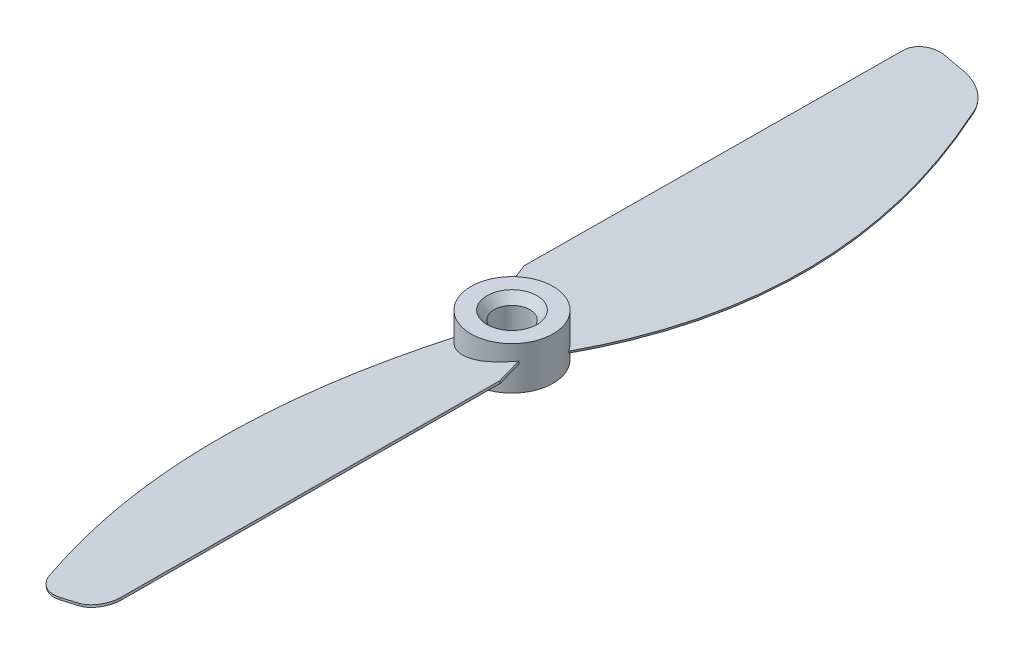
ISO-10303-21;
HEADER;
FILE_DESCRIPTION(('STEP AP214'),'2;1');
FILE_NAME('part.step','',(''),(''),'','','');
FILE_SCHEMA(('AUTOMOTIVE_DESIGN { 1 0 10303 214 1 1 1 1 }'));
ENDSEC;
DATA;
#1=APPLICATION_CONTEXT('core data for automotive mechanical design processes');
#2=APPLICATION_PROTOCOL_DEFINITION('international standard','automotive_design',2000,#1);
#3=PRODUCT_CONTEXT('',#1,'mechanical');
#4=PRODUCT('Part','Part','',(#3));
#5=PRODUCT_RELATED_PRODUCT_CATEGORY('part','',(#4));
#6=PRODUCT_DEFINITION_FORMATION('','',#4);
#7=PRODUCT_DEFINITION_CONTEXT('part definition',#1,'design');
#8=PRODUCT_DEFINITION('design','',#6,#7);
#9=PRODUCT_DEFINITION_SHAPE('','',#8);
#10=(LENGTH_UNIT() NAMED_UNIT(*) SI_UNIT(.MILLI.,.METRE.));
#11=(NAMED_UNIT(*) PLANE_ANGLE_UNIT() SI_UNIT($,.RADIAN.));
#12=(NAMED_UNIT(*) SI_UNIT($,.STERADIAN.) SOLID_ANGLE_UNIT());
#13=UNCERTAINTY_MEASURE_WITH_UNIT(LENGTH_MEASURE(1.E-05),#10,'distance_accuracy_value','');
#14=(GEOMETRIC_REPRESENTATION_CONTEXT(3) GLOBAL_UNCERTAINTY_ASSIGNED_CONTEXT((#13)) GLOBAL_UNIT_ASSIGNED_CONTEXT((#10,
#11,#12)) REPRESENTATION_CONTEXT('',''));
#15=CARTESIAN_POINT('',(0.,0.,0.));
#16=DIRECTION('',(0.,0.,1.));
#17=DIRECTION('',(1.,0.,0.));
#18=AXIS2_PLACEMENT_3D('',#15,#16,#17);
#19=CARTESIAN_POINT('',(0.,3.,0.));
#20=DIRECTION('',(0.,-1.,0.));
#21=DIRECTION('',(0.,0.,-1.));
#22=AXIS2_PLACEMENT_3D('',#19,#20,#21);
#23=CYLINDRICAL_SURFACE('',#22,5.75);
#24=CARTESIAN_POINT('',(0.,-0.307891232338017,0.));
#25=DIRECTION('',(0.224951054343865,0.974370064785235,0.));
#26=DIRECTION('',(0.974370064785235,-0.224951054343865,0.));
#27=AXIS2_PLACEMENT_3D('',#24,#25,#26);
#28=ELLIPSE('',#27,5.901248619812,5.75);
#29=CARTESIAN_POINT('',(4.78791337667616,-1.41326813287713,-3.18408314863879));
#30=VERTEX_POINT('',#29);
#31=CARTESIAN_POINT('',(-2.37394242916437,0.240176562119387,-5.23706953772939));
#32=VERTEX_POINT('',#31);
#33=EDGE_CURVE('E287',#30,#32,#28,.T.);
#34=ORIENTED_EDGE('',*,*,#33,.F.);
#35=CARTESIAN_POINT('',(4.82986929270787,-1.11506318698037,-3.12007413619574));
#36=CARTESIAN_POINT('',(4.82292127069583,-1.16475166658804,-3.13082907042638));
#37=CARTESIAN_POINT('',(4.81595093335384,-1.21444631854994,-3.14154062191195));
#38=CARTESIAN_POINT('',(4.80196562800994,-1.31384796718219,-3.16287695939297));
#39=CARTESIAN_POINT('',(4.79495066000803,-1.36355496385255,-3.17350174538841));
#40=CARTESIAN_POINT('',(4.78791337667616,-1.41326813287713,-3.18408314863879));
#41=B_SPLINE_CURVE_WITH_KNOTS('',3,(#35,#36,#37,#38,#39,#40),.UNSPECIFIED.,.F.,.F.,(4,2,4),(0.,
0.153934831482453,0.307869662964906),.UNSPECIFIED.);
#42=CARTESIAN_POINT('',(4.82986929270787,-1.11506318698037,-3.12007413619574));
#43=VERTEX_POINT('',#42);
#44=EDGE_CURVE('E278',#43,#30,#41,.T.);
#45=ORIENTED_EDGE('',*,*,#44,.F.);
#46=CARTESIAN_POINT('',(0.,0.,0.));
#47=DIRECTION('',(0.224951054343865,0.974370064785235,0.));
#48=DIRECTION('',(0.974370064785235,-0.224951054343865,0.));
#49=AXIS2_PLACEMENT_3D('',#46,#47,#48);
#50=ELLIPSE('',#49,5.901248619812,5.75);
#51=CARTESIAN_POINT('',(-2.6811952004603,0.619002685984812,-5.08661894553039));
#52=VERTEX_POINT('',#51);
#53=EDGE_CURVE('E389',#43,#52,#50,.T.);
#54=ORIENTED_EDGE('',*,*,#53,.T.);
#55=CARTESIAN_POINT('',(-2.37394242916438,0.240176562119388,-5.23706953772939));
#56=CARTESIAN_POINT('',(-2.39044343595495,0.262017553280154,-5.22958997272626));
#57=CARTESIAN_POINT('',(-2.40708173850052,0.283700087275911,-5.22195362383161));
#58=CARTESIAN_POINT('',(-2.44058343183624,0.326765324251707,-5.20638001088834));
#59=CARTESIAN_POINT('',(-2.45744672283187,0.348148152067933,-5.19844287755547));
#60=CARTESIAN_POINT('',(-2.49136029475435,0.39064621501174,-5.18227526246907));
#61=CARTESIAN_POINT('',(-2.50841054379051,0.411761494491954,-5.17404483022275));
#62=CARTESIAN_POINT('',(-2.54265942368253,0.453755729119978,-5.15730029922399));
#63=CARTESIAN_POINT('',(-2.55985804673507,0.474634696564034,-5.14878621532282));
#64=CARTESIAN_POINT('',(-2.59436950322992,0.516191560804143,-5.13148315678602));
#65=CARTESIAN_POINT('',(-2.61168236099832,0.536869412290609,-5.12269412200461));
#66=CARTESIAN_POINT('',(-2.64638880225902,0.578056786100979,-5.10485141163782));
#67=CARTESIAN_POINT('',(-2.66378241288782,0.598566244288931,-5.09579764071252));
#68=CARTESIAN_POINT('',(-2.68119520046029,0.619002685984805,-5.08661894553039));
#69=B_SPLINE_CURVE_WITH_KNOTS('',3,(#55,#56,#57,#58,#59,#60,#61,#62,#63,#64,#65,#66,#67,#68),
.UNSPECIFIED.,.F.,.F.,(4,2,2,2,2,2,4),(0.,0.0851287380510146,0.170220895584758,
0.255298757449764,0.340372171835597,0.425464328065218,0.510587515560284),.UNSPECIFIED.);
#70=EDGE_CURVE('E288',#32,#52,#69,.T.);
#71=ORIENTED_EDGE('',*,*,#70,.F.);
#72=EDGE_LOOP('',(#34,#45,#54,#71));
#73=FACE_BOUND('',#72,.T.);
#74=CARTESIAN_POINT('',(0.,3.,0.));
#75=DIRECTION('',(0.,1.,0.));
#76=DIRECTION('',(0.,0.,1.));
#77=AXIS2_PLACEMENT_3D('',#74,#75,#76);
#78=CIRCLE('',#77,5.75);
#79=CARTESIAN_POINT('',(0.,3.,5.75));
#80=VERTEX_POINT('',#79);
#81=EDGE_CURVE('E383',#80,#80,#78,.T.);
#82=ORIENTED_EDGE('',*,*,#81,.F.);
#83=EDGE_LOOP('',(#82));
#84=FACE_BOUND('',#83,.T.);
#85=CARTESIAN_POINT('',(0.,-3.,0.));
#86=DIRECTION('',(0.,1.,0.));
#87=DIRECTION('',(0.,0.,1.));
#88=AXIS2_PLACEMENT_3D('',#85,#86,#87);
#89=CIRCLE('',#88,5.75);
#90=CARTESIAN_POINT('',(0.,-3.,5.75));
#91=VERTEX_POINT('',#90);
#92=EDGE_CURVE('E380',#91,#91,#89,.T.);
#93=ORIENTED_EDGE('',*,*,#92,.T.);
#94=EDGE_LOOP('',(#93));
#95=FACE_BOUND('',#94,.T.);
#96=CARTESIAN_POINT('',(0.,-0.307891232338017,0.));
#97=DIRECTION('',(-0.224951054343865,0.974370064785235,0.));
#98=DIRECTION('',(-0.974370064785235,-0.224951054343865,0.));
#99=AXIS2_PLACEMENT_3D('',#96,#97,#98);
#100=ELLIPSE('',#99,5.901248619812,5.75);
#101=CARTESIAN_POINT('',(-4.78791337667616,-1.41326813287713,3.18408314863879));
#102=VERTEX_POINT('',#101);
#103=CARTESIAN_POINT('',(2.37394242916437,0.240176562119387,5.23706953772939));
#104=VERTEX_POINT('',#103);
#105=EDGE_CURVE('E163',#102,#104,#100,.T.);
#106=ORIENTED_EDGE('',*,*,#105,.F.);
#107=CARTESIAN_POINT('',(-4.82986929270787,-1.11506318698037,3.12007413619574));
#108=CARTESIAN_POINT('',(-4.82292127069583,-1.16475166658804,3.13082907042638));
#109=CARTESIAN_POINT('',(-4.81595093335384,-1.21444631854994,3.14154062191195));
#110=CARTESIAN_POINT('',(-4.80196562800994,-1.31384796718219,3.16287695939297));
#111=CARTESIAN_POINT('',(-4.79495066000803,-1.36355496385255,3.17350174538841));
#112=CARTESIAN_POINT('',(-4.78791337667616,-1.41326813287713,3.18408314863879));
#113=B_SPLINE_CURVE_WITH_KNOTS('',3,(#107,#108,#109,#110,#111,#112),.UNSPECIFIED.,.F.,.F.,(4,2,
4),(0.,0.153934831482453,0.307869662964906),.UNSPECIFIED.);
#114=CARTESIAN_POINT('',(-4.82986929270787,-1.11506318698037,3.12007413619574));
#115=VERTEX_POINT('',#114);
#116=EDGE_CURVE('E312',#115,#102,#113,.T.);
#117=ORIENTED_EDGE('',*,*,#116,.F.);
#118=CARTESIAN_POINT('',(0.,0.,0.));
#119=DIRECTION('',(-0.224951054343865,0.974370064785235,0.));
#120=DIRECTION('',(-0.974370064785235,-0.224951054343865,0.));
#121=AXIS2_PLACEMENT_3D('',#118,#119,#120);
#122=ELLIPSE('',#121,5.901248619812,5.75);
#123=CARTESIAN_POINT('',(2.6811952004603,0.619002685984812,5.08661894553039));
#124=VERTEX_POINT('',#123);
#125=EDGE_CURVE('E313',#115,#124,#122,.T.);
#126=ORIENTED_EDGE('',*,*,#125,.T.);
#127=CARTESIAN_POINT('',(2.37394242916438,0.240176562119388,5.23706953772939));
#128=CARTESIAN_POINT('',(2.39044343595495,0.262017553280154,5.22958997272626));
#129=CARTESIAN_POINT('',(2.40708173850052,0.283700087275911,5.22195362383161));
#130=CARTESIAN_POINT('',(2.44058343183624,0.326765324251707,5.20638001088834));
#131=CARTESIAN_POINT('',(2.45744672283187,0.348148152067933,5.19844287755547));
#132=CARTESIAN_POINT('',(2.49136029475435,0.39064621501174,5.18227526246907));
#133=CARTESIAN_POINT('',(2.50841054379051,0.411761494491954,5.17404483022275));
#134=CARTESIAN_POINT('',(2.54265942368253,0.453755729119978,5.15730029922399));
#135=CARTESIAN_POINT('',(2.55985804673507,0.474634696564034,5.14878621532282));
#136=CARTESIAN_POINT('',(2.59436950322992,0.516191560804143,5.13148315678602));
#137=CARTESIAN_POINT('',(2.61168236099832,0.536869412290609,5.12269412200461));
#138=CARTESIAN_POINT('',(2.64638880225902,0.578056786100979,5.10485141163782));
#139=CARTESIAN_POINT('',(2.66378241288782,0.598566244288931,5.09579764071252));
#140=CARTESIAN_POINT('',(2.68119520046029,0.619002685984805,5.08661894553039));
#141=B_SPLINE_CURVE_WITH_KNOTS('',3,(#127,#128,#129,#130,#131,#132,#133,#134,#135,#136,#137,
#138,#139,#140),.UNSPECIFIED.,.F.,.F.,(4,2,2,2,2,2,4),(0.,0.0851287380510146,0.170220895584758,
0.255298757449764,0.340372171835597,0.425464328065218,0.510587515560284),.UNSPECIFIED.);
#142=EDGE_CURVE('E305',#104,#124,#141,.T.);
#143=ORIENTED_EDGE('',*,*,#142,.F.);
#144=EDGE_LOOP('',(#106,#117,#126,#143));
#145=FACE_BOUND('',#144,.T.);
#146=ADVANCED_FACE('F41',(#73,#84,#95,#145),#23,.T.);
#147=CARTESIAN_POINT('',(0.,3.,0.));
#148=DIRECTION('',(0.,1.,0.));
#149=DIRECTION('',(0.,0.,1.));
#150=AXIS2_PLACEMENT_3D('',#147,#148,#149);
#151=PLANE('',#150);
#152=CARTESIAN_POINT('',(0.,3.,0.));
#153=DIRECTION('',(0.,1.,0.));
#154=DIRECTION('',(0.,0.,1.));
#155=AXIS2_PLACEMENT_3D('',#152,#153,#154);
#156=CIRCLE('',#155,3.5);
#157=CARTESIAN_POINT('',(0.,3.,3.5));
#158=VERTEX_POINT('',#157);
#159=EDGE_CURVE('E51',#158,#158,#156,.F.);
#160=ORIENTED_EDGE('',*,*,#159,.T.);
#161=EDGE_LOOP('',(#160));
#162=FACE_BOUND('',#161,.T.);
#163=ORIENTED_EDGE('',*,*,#81,.T.);
#164=EDGE_LOOP('',(#163));
#165=FACE_BOUND('',#164,.T.);
#166=ADVANCED_FACE('F275',(#162,#165),#151,.T.);
#167=CARTESIAN_POINT('',(0.,-3.,0.));
#168=DIRECTION('',(0.,1.,0.));
#169=DIRECTION('',(0.,0.,1.));
#170=AXIS2_PLACEMENT_3D('',#167,#168,#169);
#171=PLANE('',#170);
#172=CARTESIAN_POINT('',(0.,-3.,0.));
#173=DIRECTION('',(0.,1.,0.));
#174=DIRECTION('',(0.,0.,1.));
#175=AXIS2_PLACEMENT_3D('',#172,#173,#174);
#176=CIRCLE('',#175,3.6917535925942);
#177=CARTESIAN_POINT('',(0.,-3.,3.6917535925942));
#178=VERTEX_POINT('',#177);
#179=EDGE_CURVE('E11',#178,#178,#176,.T.);
#180=ORIENTED_EDGE('',*,*,#179,.T.);
#181=EDGE_LOOP('',(#180));
#182=FACE_BOUND('',#181,.T.);
#183=ORIENTED_EDGE('',*,*,#92,.F.);
#184=EDGE_LOOP('',(#183));
#185=FACE_BOUND('',#184,.T.);
#186=ADVANCED_FACE('F271',(#182,#185),#171,.F.);
#187=CARTESIAN_POINT('',(4.33268078118732,-1.30816940701523,-59.9605814846105));
#188=CARTESIAN_POINT('',(16.134178475047,-4.03275983216913,-30.5036904241544));
#189=CARTESIAN_POINT('',(4.33268078118732,-1.30816940701523,-2.06466228701174));
#190=B_SPLINE_CURVE_WITH_KNOTS('',2,(#187,#188,#189),.UNSPECIFIED.,.F.,.F.,(3,3),(0.,1.),.UNSPECIFIED.);
#191=DIRECTION('',(0.224951054343865,0.974370064785235,0.));
#192=VECTOR('',#191,1.);
#193=SURFACE_OF_LINEAR_EXTRUSION('',#190,#192);
#194=CARTESIAN_POINT('',(4.40016609749048,-1.01585838757966,-59.9605814846105));
#195=CARTESIAN_POINT('',(16.2016637913502,-3.74044881273356,-30.5036904241544));
#196=CARTESIAN_POINT('',(4.40016609749048,-1.01585838757966,-2.06466228701174));
#197=B_SPLINE_CURVE_WITH_KNOTS('',2,(#194,#195,#196),.UNSPECIFIED.,.F.,.F.,(3,3),(0.,1.),.UNSPECIFIED.);
#198=CARTESIAN_POINT('',(4.40016609749048,-1.01585838757966,-59.9605814846105));
#199=VERTEX_POINT('',#198);
#200=EDGE_CURVE('E174',#199,#43,#197,.T.);
#201=ORIENTED_EDGE('',*,*,#200,.T.);
#202=ORIENTED_EDGE('',*,*,#44,.T.);
#203=CARTESIAN_POINT('',(4.33268078118732,-1.30816940701523,-59.9605814846105));
#204=VERTEX_POINT('',#203);
#205=EDGE_CURVE('E248',#204,#30,#190,.T.);
#206=ORIENTED_EDGE('',*,*,#205,.F.);
#207=DIRECTION('',(0.224951054343865,0.974370064785235,0.));
#208=VECTOR('',#207,1.);
#209=CARTESIAN_POINT('',(4.33268078118732,-1.30816940701523,-59.9605814846105));
#210=LINE('',#209,#208);
#211=EDGE_CURVE('E631',#204,#199,#210,.T.);
#212=ORIENTED_EDGE('',*,*,#211,.T.);
#213=EDGE_LOOP('',(#201,#202,#206,#212));
#214=FACE_BOUND('',#213,.T.);
#215=ADVANCED_FACE('F265',(#214),#193,.F.);
#216=CARTESIAN_POINT('',(4.33268078118732,-1.30816940701523,-2.06466228701174));
#217=CARTESIAN_POINT('',(0.550724996687214,-0.435036116130827,-8.03956377940773));
#218=CARTESIAN_POINT('',(-4.81248266636104,0.803157935667884,-3.8114140633015));
#219=B_SPLINE_CURVE_WITH_KNOTS('',2,(#216,#217,#218),.UNSPECIFIED.,.F.,.F.,(3,3),(0.,1.),.UNSPECIFIED.);
#220=DIRECTION('',(0.224951054343865,0.974370064785235,0.));
#221=VECTOR('',#220,1.);
#222=SURFACE_OF_LINEAR_EXTRUSION('',#219,#221);
#223=CARTESIAN_POINT('',(-4.81248266636104,0.803157935667884,-3.8114140633015));
#224=VERTEX_POINT('',#223);
#225=EDGE_CURVE('E255',#32,#224,#219,.T.);
#226=ORIENTED_EDGE('',*,*,#225,.F.);
#227=ORIENTED_EDGE('',*,*,#70,.T.);
#228=CARTESIAN_POINT('',(4.40016609749048,-1.01585838757966,-2.06466228701174));
#229=CARTESIAN_POINT('',(0.618210312990374,-0.142725096695256,-8.03956377940773));
#230=CARTESIAN_POINT('',(-4.74499735005788,1.09546895510345,-3.8114140633015));
#231=B_SPLINE_CURVE_WITH_KNOTS('',2,(#228,#229,#230),.UNSPECIFIED.,.F.,.F.,(3,3),(0.,1.),.UNSPECIFIED.);
#232=CARTESIAN_POINT('',(-4.74499735005788,1.09546895510345,-3.8114140633015));
#233=VERTEX_POINT('',#232);
#234=EDGE_CURVE('E66',#52,#233,#231,.T.);
#235=ORIENTED_EDGE('',*,*,#234,.T.);
#236=DIRECTION('',(0.224951054343865,0.974370064785235,0.));
#237=VECTOR('',#236,1.);
#238=CARTESIAN_POINT('',(-4.81248266636104,0.803157935667884,-3.8114140633015));
#239=LINE('',#238,#237);
#240=EDGE_CURVE('E384',#224,#233,#239,.T.);
#241=ORIENTED_EDGE('',*,*,#240,.F.);
#242=EDGE_LOOP('',(#226,#227,#235,#241));
#243=FACE_BOUND('',#242,.T.);
#244=ADVANCED_FACE('F270',(#243),#222,.F.);
#245=CARTESIAN_POINT('',(-4.81248266636104,0.803157935667884,-3.8114140633015));
#246=DIRECTION('',(0.919116407462492,-0.212194742424692,-0.331961474904184));
#247=DIRECTION('',(-0.33969726484159,0.,-0.940534830965415));
#248=AXIS2_PLACEMENT_3D('',#245,#246,#247);
#249=PLANE('',#248);
#250=DIRECTION('',(-0.323453323808592,0.0746750837812408,-0.94329294451906));
#251=VECTOR('',#250,1.);
#252=CARTESIAN_POINT('',(-4.74499735005788,1.09546895510345,-3.8114140633015));
#253=LINE('',#252,#251);
#254=CARTESIAN_POINT('',(-6.11658960329372,1.41212597756985,-7.8114140633015));
#255=VERTEX_POINT('',#254);
#256=EDGE_CURVE('E603',#233,#255,#253,.T.);
#257=ORIENTED_EDGE('',*,*,#256,.T.);
#258=DIRECTION('',(0.224951054343865,0.974370064785235,0.));
#259=VECTOR('',#258,1.);
#260=CARTESIAN_POINT('',(-6.18407491959688,1.11981495813428,-7.8114140633015));
#261=LINE('',#260,#259);
#262=CARTESIAN_POINT('',(-6.18407491959688,1.11981495813428,-7.8114140633015));
#263=VERTEX_POINT('',#262);
#264=EDGE_CURVE('E392',#263,#255,#261,.T.);
#265=ORIENTED_EDGE('',*,*,#264,.F.);
#266=DIRECTION('',(-0.323453323808592,0.0746750837812408,-0.94329294451906));
#267=VECTOR('',#266,1.);
#268=CARTESIAN_POINT('',(-4.81248266636104,0.803157935667884,-3.8114140633015));
#269=LINE('',#268,#267);
#270=EDGE_CURVE('E655',#224,#263,#269,.T.);
#271=ORIENTED_EDGE('',*,*,#270,.F.);
#272=ORIENTED_EDGE('',*,*,#240,.T.);
#273=EDGE_LOOP('',(#257,#265,#271,#272));
#274=FACE_BOUND('',#273,.T.);
#275=ADVANCED_FACE('F557',(#274),#249,.F.);
#276=CARTESIAN_POINT('',(-6.18407491959688,1.11981495813428,-7.8114140633015));
#277=DIRECTION('',(0.974348988273258,-0.22494618844767,0.00657733637144159));
#278=DIRECTION('',(0.224951054343865,0.974370064785235,0.));
#279=AXIS2_PLACEMENT_3D('',#276,#277,#278);
#280=PLANE('',#279);
#281=DIRECTION('',(0.00640875966635583,-0.00147957875153004,-0.99997836908918));
#282=VECTOR('',#281,1.);
#283=CARTESIAN_POINT('',(-6.11658960329372,1.41212597756985,-7.8114140633015));
#284=LINE('',#283,#282);
#285=CARTESIAN_POINT('',(-5.77878735419081,1.33413818336131,-60.5197320091143));
#286=VERTEX_POINT('',#285);
#287=EDGE_CURVE('E609',#255,#286,#284,.T.);
#288=ORIENTED_EDGE('',*,*,#287,.T.);
#289=DIRECTION('',(0.224951054343865,0.974370064785235,0.));
#290=VECTOR('',#289,1.);
#291=CARTESIAN_POINT('',(-5.84627267049397,1.04182716392574,-60.5197320091143));
#292=LINE('',#291,#290);
#293=CARTESIAN_POINT('',(-5.84627267049397,1.04182716392574,-60.5197320091143));
#294=VERTEX_POINT('',#293);
#295=EDGE_CURVE('E615',#294,#286,#292,.T.);
#296=ORIENTED_EDGE('',*,*,#295,.F.);
#297=DIRECTION('',(0.00640875966635583,-0.00147957875153004,-0.99997836908918));
#298=VECTOR('',#297,1.);
#299=CARTESIAN_POINT('',(-6.18407491959688,1.11981495813428,-7.8114140633015));
#300=LINE('',#299,#298);
#301=EDGE_CURVE('E613',#263,#294,#300,.T.);
#302=ORIENTED_EDGE('',*,*,#301,.F.);
#303=ORIENTED_EDGE('',*,*,#264,.T.);
#304=EDGE_LOOP('',(#288,#296,#302,#303));
#305=FACE_BOUND('',#304,.T.);
#306=ADVANCED_FACE('F548',(#305),#280,.F.);
#307=CARTESIAN_POINT('',(-2.9232257056742,0.366988598582733,-60.5));
#308=DIRECTION('',(0.224951054343865,0.974370064785235,0.));
#309=DIRECTION('',(-0.974370064785235,0.224951054343865,0.));
#310=AXIS2_PLACEMENT_3D('',#307,#308,#309);
#311=CYLINDRICAL_SURFACE('',#310,3.);
#312=CARTESIAN_POINT('',(-2.85574038937104,0.659299618018303,-60.5));
#313=DIRECTION('',(-0.224951054343865,-0.974370064785235,0.));
#314=DIRECTION('',(0.974370064785235,-0.224951054343865,0.));
#315=AXIS2_PLACEMENT_3D('',#312,#313,#314);
#316=CIRCLE('',#315,3.);
#317=CARTESIAN_POINT('',(-2.85574038937102,0.659299618018299,-63.5));
#318=VERTEX_POINT('',#317);
#319=EDGE_CURVE('E619',#286,#318,#316,.T.);
#320=ORIENTED_EDGE('',*,*,#319,.T.);
#321=DIRECTION('',(0.224951054343865,0.974370064785235,0.));
#322=VECTOR('',#321,1.);
#323=CARTESIAN_POINT('',(-2.92322570567417,0.366988598582728,-63.5));
#324=LINE('',#323,#322);
#325=CARTESIAN_POINT('',(-2.92322570567417,0.366988598582728,-63.5));
#326=VERTEX_POINT('',#325);
#327=EDGE_CURVE('E640',#326,#318,#324,.T.);
#328=ORIENTED_EDGE('',*,*,#327,.F.);
#329=CARTESIAN_POINT('',(-2.9232257056742,0.366988598582733,-60.5));
#330=DIRECTION('',(-0.224951054343865,-0.974370064785235,0.));
#331=DIRECTION('',(0.974370064785235,-0.224951054343865,0.));
#332=AXIS2_PLACEMENT_3D('',#329,#330,#331);
#333=CIRCLE('',#332,3.);
#334=EDGE_CURVE('E647',#294,#326,#333,.T.);
#335=ORIENTED_EDGE('',*,*,#334,.F.);
#336=ORIENTED_EDGE('',*,*,#295,.T.);
#337=EDGE_LOOP('',(#320,#328,#335,#336));
#338=FACE_BOUND('',#337,.T.);
#339=ADVANCED_FACE('F539',(#338),#311,.T.);
#340=CARTESIAN_POINT('',(-2.92322570567418,0.366988598582728,-63.5));
#341=DIRECTION('',(0.,0.,1.));
#342=DIRECTION('',(1.,0.,0.));
#343=AXIS2_PLACEMENT_3D('',#340,#341,#342);
#344=PLANE('',#343);
#345=DIRECTION('',(0.974370064785235,-0.224951054343865,0.));
#346=VECTOR('',#345,1.);
#347=CARTESIAN_POINT('',(-2.85574038937102,0.659299618018299,-63.5));
#348=LINE('',#347,#346);
#349=CARTESIAN_POINT('',(-0.259187779248828,0.0598382137570287,-63.5));
#350=VERTEX_POINT('',#349);
#351=EDGE_CURVE('E623',#318,#350,#348,.T.);
#352=ORIENTED_EDGE('',*,*,#351,.T.);
#353=DIRECTION('',(0.224951054343865,0.974370064785235,0.));
#354=VECTOR('',#353,1.);
#355=CARTESIAN_POINT('',(-0.326673095551987,-0.232472805678542,-63.5));
#356=LINE('',#355,#354);
#357=CARTESIAN_POINT('',(-0.326673095551987,-0.232472805678542,-63.5));
#358=VERTEX_POINT('',#357);
#359=EDGE_CURVE('E635',#358,#350,#356,.T.);
#360=ORIENTED_EDGE('',*,*,#359,.F.);
#361=DIRECTION('',(0.974370064785235,-0.224951054343865,0.));
#362=VECTOR('',#361,1.);
#363=CARTESIAN_POINT('',(-2.92322570567418,0.366988598582728,-63.5));
#364=LINE('',#363,#362);
#365=EDGE_CURVE('E650',#326,#358,#364,.T.);
#366=ORIENTED_EDGE('',*,*,#365,.F.);
#367=ORIENTED_EDGE('',*,*,#327,.T.);
#368=EDGE_LOOP('',(#352,#360,#366,#367));
#369=FACE_BOUND('',#368,.T.);
#370=ADVANCED_FACE('F530',(#369),#344,.F.);
#371=CARTESIAN_POINT('',(-0.326673095551989,-0.232472805678541,-58.5));
#372=DIRECTION('',(0.224951054343865,0.974370064785235,0.));
#373=DIRECTION('',(-0.974370064785235,0.224951054343865,0.));
#374=AXIS2_PLACEMENT_3D('',#371,#372,#373);
#375=CYLINDRICAL_SURFACE('',#374,5.);
#376=CARTESIAN_POINT('',(-0.259187779248829,0.0598382137570291,-58.5));
#377=DIRECTION('',(-0.224951054343865,-0.974370064785235,0.));
#378=DIRECTION('',(-0.974370064785235,0.224951054343865,0.));
#379=AXIS2_PLACEMENT_3D('',#376,#377,#378);
#380=CIRCLE('',#379,5.);
#381=EDGE_CURVE('E256',#350,#199,#380,.T.);
#382=ORIENTED_EDGE('',*,*,#381,.T.);
#383=ORIENTED_EDGE('',*,*,#211,.F.);
#384=CARTESIAN_POINT('',(-0.326673095551989,-0.232472805678541,-58.5));
#385=DIRECTION('',(-0.224951054343865,-0.974370064785235,0.));
#386=DIRECTION('',(-0.974370064785235,0.224951054343865,0.));
#387=AXIS2_PLACEMENT_3D('',#384,#385,#386);
#388=CIRCLE('',#387,5.);
#389=EDGE_CURVE('E636',#358,#204,#388,.T.);
#390=ORIENTED_EDGE('',*,*,#389,.F.);
#391=ORIENTED_EDGE('',*,*,#359,.T.);
#392=EDGE_LOOP('',(#382,#383,#390,#391));
#393=FACE_BOUND('',#392,.T.);
#394=ADVANCED_FACE('F523',(#393),#375,.T.);
#395=CARTESIAN_POINT('',(10.2334296281172,-2.67046461959218,-30.7581561549827));
#396=DIRECTION('',(0.224951054343865,0.974370064785235,0.));
#397=DIRECTION('',(-0.974370064785235,0.224951054343865,0.));
#398=AXIS2_PLACEMENT_3D('',#395,#396,#397);
#399=PLANE('',#398);
#400=ORIENTED_EDGE('',*,*,#205,.T.);
#401=ORIENTED_EDGE('',*,*,#33,.T.);
#402=ORIENTED_EDGE('',*,*,#225,.T.);
#403=ORIENTED_EDGE('',*,*,#270,.T.);
#404=ORIENTED_EDGE('',*,*,#301,.T.);
#405=ORIENTED_EDGE('',*,*,#334,.T.);
#406=ORIENTED_EDGE('',*,*,#365,.T.);
#407=ORIENTED_EDGE('',*,*,#389,.T.);
#408=EDGE_LOOP('',(#400,#401,#402,#403,#404,#405,#406,#407));
#409=FACE_BOUND('',#408,.T.);
#410=ADVANCED_FACE('F330',(#409),#399,.F.);
#411=CARTESIAN_POINT('',(10.3009149444203,-2.37815360015661,-30.7581561549827));
#412=DIRECTION('',(0.224951054343865,0.974370064785235,0.));
#413=DIRECTION('',(-0.974370064785235,0.224951054343865,0.));
#414=AXIS2_PLACEMENT_3D('',#411,#412,#413);
#415=PLANE('',#414);
#416=ORIENTED_EDGE('',*,*,#53,.F.);
#417=ORIENTED_EDGE('',*,*,#200,.F.);
#418=ORIENTED_EDGE('',*,*,#381,.F.);
#419=ORIENTED_EDGE('',*,*,#351,.F.);
#420=ORIENTED_EDGE('',*,*,#319,.F.);
#421=ORIENTED_EDGE('',*,*,#287,.F.);
#422=ORIENTED_EDGE('',*,*,#256,.F.);
#423=ORIENTED_EDGE('',*,*,#234,.F.);
#424=EDGE_LOOP('',(#416,#417,#418,#419,#420,#421,#422,#423));
#425=FACE_BOUND('',#424,.T.);
#426=ADVANCED_FACE('F328',(#425),#415,.T.);
#427=CARTESIAN_POINT('',(-4.33268078118732,-1.30816940701523,59.9605814846105));
#428=CARTESIAN_POINT('',(-16.134178475047,-4.03275983216913,30.5036904241544));
#429=CARTESIAN_POINT('',(-4.33268078118732,-1.30816940701523,2.06466228701174));
#430=B_SPLINE_CURVE_WITH_KNOTS('',2,(#427,#428,#429),.UNSPECIFIED.,.F.,.F.,(3,3),(0.,1.),.UNSPECIFIED.);
#431=DIRECTION('',(-0.224951054343865,0.974370064785235,0.));
#432=VECTOR('',#431,1.);
#433=SURFACE_OF_LINEAR_EXTRUSION('',#430,#432);
#434=CARTESIAN_POINT('',(-4.40016609749048,-1.01585838757966,59.9605814846105));
#435=CARTESIAN_POINT('',(-16.2016637913502,-3.74044881273356,30.5036904241544));
#436=CARTESIAN_POINT('',(-4.40016609749048,-1.01585838757966,2.06466228701174));
#437=B_SPLINE_CURVE_WITH_KNOTS('',2,(#434,#435,#436),.UNSPECIFIED.,.F.,.F.,(3,3),(0.,1.),.UNSPECIFIED.);
#438=CARTESIAN_POINT('',(-4.40016609749048,-1.01585838757966,59.9605814846105));
#439=VERTEX_POINT('',#438);
#440=EDGE_CURVE('E200',#439,#115,#437,.T.);
#441=ORIENTED_EDGE('',*,*,#440,.T.);
#442=ORIENTED_EDGE('',*,*,#116,.T.);
#443=CARTESIAN_POINT('',(-4.33268078118732,-1.30816940701523,59.9605814846105));
#444=VERTEX_POINT('',#443);
#445=EDGE_CURVE('E167',#444,#102,#430,.T.);
#446=ORIENTED_EDGE('',*,*,#445,.F.);
#447=DIRECTION('',(-0.224951054343865,0.974370064785235,0.));
#448=VECTOR('',#447,1.);
#449=CARTESIAN_POINT('',(-4.33268078118732,-1.30816940701523,59.9605814846105));
#450=LINE('',#449,#448);
#451=EDGE_CURVE('E199',#444,#439,#450,.T.);
#452=ORIENTED_EDGE('',*,*,#451,.T.);
#453=EDGE_LOOP('',(#441,#442,#446,#452));
#454=FACE_BOUND('',#453,.T.);
#455=ADVANCED_FACE('F323',(#454),#433,.F.);
#456=CARTESIAN_POINT('',(-4.33268078118732,-1.30816940701523,2.06466228701174));
#457=CARTESIAN_POINT('',(-0.550724996687214,-0.435036116130827,8.03956377940773));
#458=CARTESIAN_POINT('',(4.81248266636104,0.803157935667884,3.8114140633015));
#459=B_SPLINE_CURVE_WITH_KNOTS('',2,(#456,#457,#458),.UNSPECIFIED.,.F.,.F.,(3,3),(0.,1.),.UNSPECIFIED.);
#460=DIRECTION('',(-0.224951054343865,0.974370064785235,0.));
#461=VECTOR('',#460,1.);
#462=SURFACE_OF_LINEAR_EXTRUSION('',#459,#461);
#463=CARTESIAN_POINT('',(4.81248266636104,0.803157935667884,3.8114140633015));
#464=VERTEX_POINT('',#463);
#465=EDGE_CURVE('E155',#104,#464,#459,.T.);
#466=ORIENTED_EDGE('',*,*,#465,.F.);
#467=ORIENTED_EDGE('',*,*,#142,.T.);
#468=CARTESIAN_POINT('',(-4.40016609749048,-1.01585838757966,2.06466228701174));
#469=CARTESIAN_POINT('',(-0.618210312990374,-0.142725096695256,8.03956377940773));
#470=CARTESIAN_POINT('',(4.74499735005788,1.09546895510345,3.8114140633015));
#471=B_SPLINE_CURVE_WITH_KNOTS('',2,(#468,#469,#470),.UNSPECIFIED.,.F.,.F.,(3,3),(0.,1.),.UNSPECIFIED.);
#472=CARTESIAN_POINT('',(4.74499735005788,1.09546895510345,3.8114140633015));
#473=VERTEX_POINT('',#472);
#474=EDGE_CURVE('E58',#124,#473,#471,.T.);
#475=ORIENTED_EDGE('',*,*,#474,.T.);
#476=DIRECTION('',(-0.224951054343865,0.974370064785235,0.));
#477=VECTOR('',#476,1.);
#478=CARTESIAN_POINT('',(4.81248266636104,0.803157935667884,3.8114140633015));
#479=LINE('',#478,#477);
#480=EDGE_CURVE('E170',#464,#473,#479,.T.);
#481=ORIENTED_EDGE('',*,*,#480,.F.);
#482=EDGE_LOOP('',(#466,#467,#475,#481));
#483=FACE_BOUND('',#482,.T.);
#484=ADVANCED_FACE('F171',(#483),#462,.F.);
#485=CARTESIAN_POINT('',(4.81248266636104,0.803157935667884,3.8114140633015));
#486=DIRECTION('',(-0.919116407462492,-0.212194742424692,0.331961474904184));
#487=DIRECTION('',(0.33969726484159,0.,0.940534830965415));
#488=AXIS2_PLACEMENT_3D('',#485,#486,#487);
#489=PLANE('',#488);
#490=DIRECTION('',(0.323453323808592,0.0746750837812408,0.94329294451906));
#491=VECTOR('',#490,1.);
#492=CARTESIAN_POINT('',(4.74499735005788,1.09546895510345,3.8114140633015));
#493=LINE('',#492,#491);
#494=CARTESIAN_POINT('',(6.11658960329372,1.41212597756985,7.8114140633015));
#495=VERTEX_POINT('',#494);
#496=EDGE_CURVE('E213',#473,#495,#493,.T.);
#497=ORIENTED_EDGE('',*,*,#496,.T.);
#498=DIRECTION('',(-0.224951054343865,0.974370064785235,0.));
#499=VECTOR('',#498,1.);
#500=CARTESIAN_POINT('',(6.18407491959688,1.11981495813428,7.8114140633015));
#501=LINE('',#500,#499);
#502=CARTESIAN_POINT('',(6.18407491959688,1.11981495813428,7.8114140633015));
#503=VERTEX_POINT('',#502);
#504=EDGE_CURVE('E175',#503,#495,#501,.T.);
#505=ORIENTED_EDGE('',*,*,#504,.F.);
#506=DIRECTION('',(0.323453323808592,0.0746750837812408,0.94329294451906));
#507=VECTOR('',#506,1.);
#508=CARTESIAN_POINT('',(4.81248266636104,0.803157935667884,3.8114140633015));
#509=LINE('',#508,#507);
#510=EDGE_CURVE('E160',#464,#503,#509,.T.);
#511=ORIENTED_EDGE('',*,*,#510,.F.);
#512=ORIENTED_EDGE('',*,*,#480,.T.);
#513=EDGE_LOOP('',(#497,#505,#511,#512));
#514=FACE_BOUND('',#513,.T.);
#515=ADVANCED_FACE('F177',(#514),#489,.F.);
#516=CARTESIAN_POINT('',(6.18407491959688,1.11981495813428,7.8114140633015));
#517=DIRECTION('',(-0.974348988273258,-0.22494618844767,-0.00657733637144159));
#518=DIRECTION('',(0.224951054343865,-0.974370064785235,0.));
#519=AXIS2_PLACEMENT_3D('',#516,#517,#518);
#520=PLANE('',#519);
#521=DIRECTION('',(-0.00640875966635583,-0.00147957875153004,0.99997836908918));
#522=VECTOR('',#521,1.);
#523=CARTESIAN_POINT('',(6.11658960329372,1.41212597756985,7.8114140633015));
#524=LINE('',#523,#522);
#525=CARTESIAN_POINT('',(5.77878735419081,1.33413818336131,60.5197320091143));
#526=VERTEX_POINT('',#525);
#527=EDGE_CURVE('E219',#495,#526,#524,.T.);
#528=ORIENTED_EDGE('',*,*,#527,.T.);
#529=DIRECTION('',(-0.224951054343865,0.974370064785235,0.));
#530=VECTOR('',#529,1.);
#531=CARTESIAN_POINT('',(5.84627267049397,1.04182716392574,60.5197320091143));
#532=LINE('',#531,#530);
#533=CARTESIAN_POINT('',(5.84627267049397,1.04182716392574,60.5197320091143));
#534=VERTEX_POINT('',#533);
#535=EDGE_CURVE('E242',#534,#526,#532,.T.);
#536=ORIENTED_EDGE('',*,*,#535,.F.);
#537=DIRECTION('',(-0.00640875966635583,-0.00147957875153004,0.99997836908918));
#538=VECTOR('',#537,1.);
#539=CARTESIAN_POINT('',(6.18407491959688,1.11981495813428,7.8114140633015));
#540=LINE('',#539,#538);
#541=EDGE_CURVE('E181',#503,#534,#540,.T.);
#542=ORIENTED_EDGE('',*,*,#541,.F.);
#543=ORIENTED_EDGE('',*,*,#504,.T.);
#544=EDGE_LOOP('',(#528,#536,#542,#543));
#545=FACE_BOUND('',#544,.T.);
#546=ADVANCED_FACE('F424',(#545),#520,.F.);
#547=CARTESIAN_POINT('',(2.9232257056742,0.366988598582733,60.5));
#548=DIRECTION('',(-0.224951054343865,0.974370064785235,0.));
#549=DIRECTION('',(-0.974370064785235,-0.224951054343865,0.));
#550=AXIS2_PLACEMENT_3D('',#547,#548,#549);
#551=CYLINDRICAL_SURFACE('',#550,3.);
#552=CARTESIAN_POINT('',(2.85574038937104,0.659299618018303,60.5));
#553=DIRECTION('',(0.224951054343865,-0.974370064785235,0.));
#554=DIRECTION('',(-0.974370064785235,-0.224951054343865,0.));
#555=AXIS2_PLACEMENT_3D('',#552,#553,#554);
#556=CIRCLE('',#555,3.);
#557=CARTESIAN_POINT('',(2.85574038937102,0.659299618018299,63.5));
#558=VERTEX_POINT('',#557);
#559=EDGE_CURVE('E222',#526,#558,#556,.T.);
#560=ORIENTED_EDGE('',*,*,#559,.T.);
#561=DIRECTION('',(-0.224951054343865,0.974370064785235,0.));
#562=VECTOR('',#561,1.);
#563=CARTESIAN_POINT('',(2.92322570567417,0.366988598582728,63.5));
#564=LINE('',#563,#562);
#565=CARTESIAN_POINT('',(2.92322570567417,0.366988598582728,63.5));
#566=VERTEX_POINT('',#565);
#567=EDGE_CURVE('E238',#566,#558,#564,.T.);
#568=ORIENTED_EDGE('',*,*,#567,.F.);
#569=CARTESIAN_POINT('',(2.9232257056742,0.366988598582733,60.5));
#570=DIRECTION('',(0.224951054343865,-0.974370064785235,0.));
#571=DIRECTION('',(-0.974370064785235,-0.224951054343865,0.));
#572=AXIS2_PLACEMENT_3D('',#569,#570,#571);
#573=CIRCLE('',#572,3.);
#574=EDGE_CURVE('E184',#534,#566,#573,.T.);
#575=ORIENTED_EDGE('',*,*,#574,.F.);
#576=ORIENTED_EDGE('',*,*,#535,.T.);
#577=EDGE_LOOP('',(#560,#568,#575,#576));
#578=FACE_BOUND('',#577,.T.);
#579=ADVANCED_FACE('F421',(#578),#551,.T.);
#580=CARTESIAN_POINT('',(2.92322570567418,0.366988598582728,63.5));
#581=DIRECTION('',(0.,0.,-1.));
#582=DIRECTION('',(-1.,0.,0.));
#583=AXIS2_PLACEMENT_3D('',#580,#581,#582);
#584=PLANE('',#583);
#585=DIRECTION('',(-0.974370064785235,-0.224951054343865,0.));
#586=VECTOR('',#585,1.);
#587=CARTESIAN_POINT('',(2.85574038937102,0.659299618018299,63.5));
#588=LINE('',#587,#586);
#589=CARTESIAN_POINT('',(0.259187779248828,0.0598382137570287,63.5));
#590=VERTEX_POINT('',#589);
#591=EDGE_CURVE('E225',#558,#590,#588,.T.);
#592=ORIENTED_EDGE('',*,*,#591,.T.);
#593=DIRECTION('',(-0.224951054343865,0.974370064785235,0.));
#594=VECTOR('',#593,1.);
#595=CARTESIAN_POINT('',(0.326673095551987,-0.232472805678542,63.5));
#596=LINE('',#595,#594);
#597=CARTESIAN_POINT('',(0.326673095551987,-0.232472805678542,63.5));
#598=VERTEX_POINT('',#597);
#599=EDGE_CURVE('E234',#598,#590,#596,.T.);
#600=ORIENTED_EDGE('',*,*,#599,.F.);
#601=DIRECTION('',(-0.974370064785235,-0.224951054343865,0.));
#602=VECTOR('',#601,1.);
#603=CARTESIAN_POINT('',(2.92322570567418,0.366988598582728,63.5));
#604=LINE('',#603,#602);
#605=EDGE_CURVE('E193',#566,#598,#604,.T.);
#606=ORIENTED_EDGE('',*,*,#605,.F.);
#607=ORIENTED_EDGE('',*,*,#567,.T.);
#608=EDGE_LOOP('',(#592,#600,#606,#607));
#609=FACE_BOUND('',#608,.T.);
#610=ADVANCED_FACE('F416',(#609),#584,.F.);
#611=CARTESIAN_POINT('',(0.326673095551989,-0.232472805678541,58.5));
#612=DIRECTION('',(-0.224951054343865,0.974370064785235,0.));
#613=DIRECTION('',(-0.974370064785235,-0.224951054343865,0.));
#614=AXIS2_PLACEMENT_3D('',#611,#612,#613);
#615=CYLINDRICAL_SURFACE('',#614,5.);
#616=CARTESIAN_POINT('',(0.259187779248829,0.0598382137570291,58.5));
#617=DIRECTION('',(0.224951054343865,-0.974370064785235,0.));
#618=DIRECTION('',(0.974370064785235,0.224951054343865,0.));
#619=AXIS2_PLACEMENT_3D('',#616,#617,#618);
#620=CIRCLE('',#619,5.);
#621=EDGE_CURVE('E228',#590,#439,#620,.T.);
#622=ORIENTED_EDGE('',*,*,#621,.T.);
#623=ORIENTED_EDGE('',*,*,#451,.F.);
#624=CARTESIAN_POINT('',(0.326673095551989,-0.232472805678541,58.5));
#625=DIRECTION('',(0.224951054343865,-0.974370064785235,0.));
#626=DIRECTION('',(0.974370064785235,0.224951054343865,0.));
#627=AXIS2_PLACEMENT_3D('',#624,#625,#626);
#628=CIRCLE('',#627,5.);
#629=EDGE_CURVE('E196',#598,#444,#628,.T.);
#630=ORIENTED_EDGE('',*,*,#629,.F.);
#631=ORIENTED_EDGE('',*,*,#599,.T.);
#632=EDGE_LOOP('',(#622,#623,#630,#631));
#633=FACE_BOUND('',#632,.T.);
#634=ADVANCED_FACE('F410',(#633),#615,.T.);
#635=CARTESIAN_POINT('',(-10.2334296281172,-2.67046461959218,30.7581561549827));
#636=DIRECTION('',(-0.224951054343865,0.974370064785235,0.));
#637=DIRECTION('',(0.974370064785235,0.224951054343865,0.));
#638=AXIS2_PLACEMENT_3D('',#635,#636,#637);
#639=PLANE('',#638);
#640=ORIENTED_EDGE('',*,*,#445,.T.);
#641=ORIENTED_EDGE('',*,*,#105,.T.);
#642=ORIENTED_EDGE('',*,*,#465,.T.);
#643=ORIENTED_EDGE('',*,*,#510,.T.);
#644=ORIENTED_EDGE('',*,*,#541,.T.);
#645=ORIENTED_EDGE('',*,*,#574,.T.);
#646=ORIENTED_EDGE('',*,*,#605,.T.);
#647=ORIENTED_EDGE('',*,*,#629,.T.);
#648=EDGE_LOOP('',(#640,#641,#642,#643,#644,#645,#646,#647));
#649=FACE_BOUND('',#648,.T.);
#650=ADVANCED_FACE('F158',(#649),#639,.F.);
#651=CARTESIAN_POINT('',(-10.3009149444203,-2.37815360015661,30.7581561549827));
#652=DIRECTION('',(-0.224951054343865,0.974370064785235,0.));
#653=DIRECTION('',(0.974370064785235,0.224951054343865,0.));
#654=AXIS2_PLACEMENT_3D('',#651,#652,#653);
#655=PLANE('',#654);
#656=ORIENTED_EDGE('',*,*,#125,.F.);
#657=ORIENTED_EDGE('',*,*,#440,.F.);
#658=ORIENTED_EDGE('',*,*,#621,.F.);
#659=ORIENTED_EDGE('',*,*,#591,.F.);
#660=ORIENTED_EDGE('',*,*,#559,.F.);
#661=ORIENTED_EDGE('',*,*,#527,.F.);
#662=ORIENTED_EDGE('',*,*,#496,.F.);
#663=ORIENTED_EDGE('',*,*,#474,.F.);
#664=EDGE_LOOP('',(#656,#657,#658,#659,#660,#661,#662,#663));
#665=FACE_BOUND('',#664,.T.);
#666=ADVANCED_FACE('F368',(#665),#655,.T.);
#667=CARTESIAN_POINT('',(0.,-3.,0.));
#668=DIRECTION('',(0.,1.,0.));
#669=DIRECTION('',(0.,0.,1.));
#670=AXIS2_PLACEMENT_3D('',#667,#668,#669);
#671=CYLINDRICAL_SURFACE('',#670,2.5);
#672=CARTESIAN_POINT('',(0.,1.80824640740581,0.));
#673=DIRECTION('',(0.,1.,0.));
#674=DIRECTION('',(0.,0.,1.));
#675=AXIS2_PLACEMENT_3D('',#672,#673,#674);
#676=CIRCLE('',#675,2.5);
#677=CARTESIAN_POINT('',(0.,1.80824640740581,2.5));
#678=VERTEX_POINT('',#677);
#679=EDGE_CURVE('E350',#678,#678,#676,.T.);
#680=ORIENTED_EDGE('',*,*,#679,.T.);
#681=EDGE_LOOP('',(#680));
#682=FACE_BOUND('',#681,.T.);
#683=CARTESIAN_POINT('',(0.,-2.,0.));
#684=DIRECTION('',(0.,1.,0.));
#685=DIRECTION('',(0.,0.,1.));
#686=AXIS2_PLACEMENT_3D('',#683,#684,#685);
#687=CIRCLE('',#686,2.5);
#688=CARTESIAN_POINT('',(0.,-2.,2.5));
#689=VERTEX_POINT('',#688);
#690=EDGE_CURVE('E346',#689,#689,#687,.F.);
#691=ORIENTED_EDGE('',*,*,#690,.T.);
#692=EDGE_LOOP('',(#691));
#693=FACE_BOUND('',#692,.T.);
#694=ADVANCED_FACE('F363',(#682,#693),#671,.F.);
#695=CARTESIAN_POINT('',(0.,1.80824640740581,0.));
#696=DIRECTION('',(0.,1.,0.));
#697=DIRECTION('',(0.,0.,1.));
#698=AXIS2_PLACEMENT_3D('',#695,#696,#697);
#699=CONICAL_SURFACE('',#698,2.5,0.698131700797741);
#700=ORIENTED_EDGE('',*,*,#159,.F.);
#701=EDGE_LOOP('',(#700));
#702=FACE_BOUND('',#701,.T.);
#703=ORIENTED_EDGE('',*,*,#679,.F.);
#704=EDGE_LOOP('',(#703));
#705=FACE_BOUND('',#704,.T.);
#706=ADVANCED_FACE('F299',(#702,#705),#699,.F.);
#707=CARTESIAN_POINT('',(0.,-3.,0.));
#708=DIRECTION('',(0.,-1.,0.));
#709=DIRECTION('',(0.,0.,-1.));
#710=AXIS2_PLACEMENT_3D('',#707,#708,#709);
#711=CONICAL_SURFACE('',#710,3.6917535925942,0.872664625997163);
#712=ORIENTED_EDGE('',*,*,#690,.F.);
#713=EDGE_LOOP('',(#712));
#714=FACE_BOUND('',#713,.T.);
#715=ORIENTED_EDGE('',*,*,#179,.F.);
#716=EDGE_LOOP('',(#715));
#717=FACE_BOUND('',#716,.T.);
#718=ADVANCED_FACE('F44',(#714,#717),#711,.F.);
#719=CLOSED_SHELL('',(#146,#166,#186,#215,#244,#275,#306,#339,#370,#394,#410,#426,#455,#484,
#515,#546,#579,#610,#634,#650,#666,#694,#706,#718));
#720=MANIFOLD_SOLID_BREP('B2',#719);
#721=ADVANCED_BREP_SHAPE_REPRESENTATION('',(#18,#720),#14);
#722=SHAPE_DEFINITION_REPRESENTATION(#9,#721);
ENDSEC;
END-ISO-10303-21;
